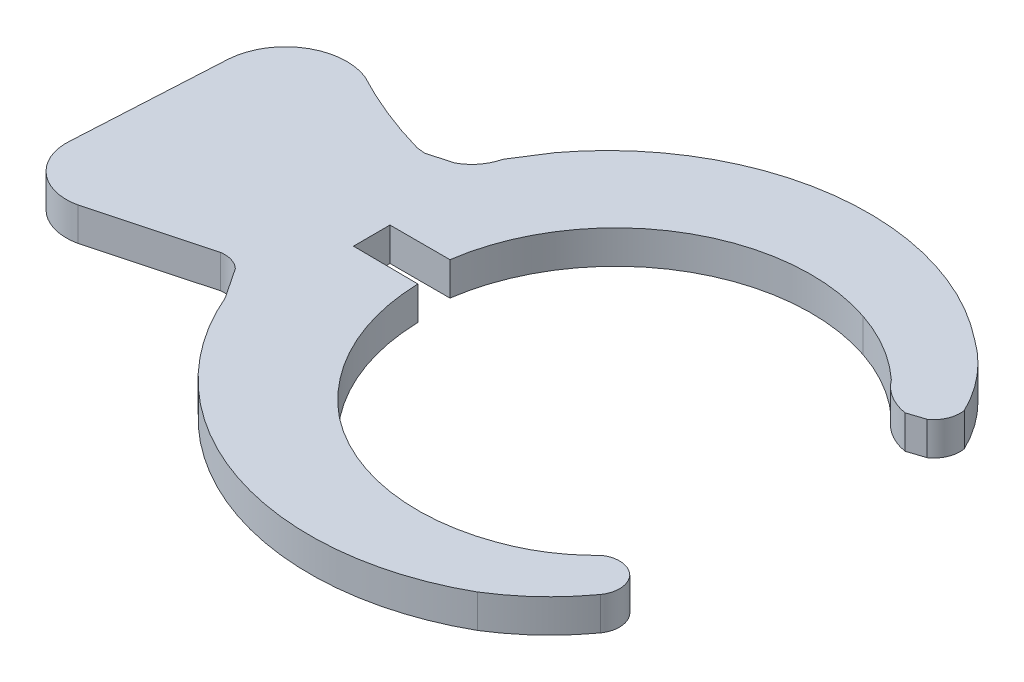
ISO-10303-21;
HEADER;
FILE_DESCRIPTION(('STEP AP214'),'2;1');
FILE_NAME('part.step','',(''),(''),'','','');
FILE_SCHEMA(('AUTOMOTIVE_DESIGN { 1 0 10303 214 1 1 1 1 }'));
ENDSEC;
DATA;
#1=APPLICATION_CONTEXT('core data for automotive mechanical design processes');
#2=APPLICATION_PROTOCOL_DEFINITION('international standard','automotive_design',2000,#1);
#3=PRODUCT_CONTEXT('',#1,'mechanical');
#4=PRODUCT('Part','Part','',(#3));
#5=PRODUCT_RELATED_PRODUCT_CATEGORY('part','',(#4));
#6=PRODUCT_DEFINITION_FORMATION('','',#4);
#7=PRODUCT_DEFINITION_CONTEXT('part definition',#1,'design');
#8=PRODUCT_DEFINITION('design','',#6,#7);
#9=PRODUCT_DEFINITION_SHAPE('','',#8);
#10=(LENGTH_UNIT() NAMED_UNIT(*) SI_UNIT(.MILLI.,.METRE.));
#11=(NAMED_UNIT(*) PLANE_ANGLE_UNIT() SI_UNIT($,.RADIAN.));
#12=(NAMED_UNIT(*) SI_UNIT($,.STERADIAN.) SOLID_ANGLE_UNIT());
#13=UNCERTAINTY_MEASURE_WITH_UNIT(LENGTH_MEASURE(1.E-05),#10,'distance_accuracy_value','');
#14=(GEOMETRIC_REPRESENTATION_CONTEXT(3) GLOBAL_UNCERTAINTY_ASSIGNED_CONTEXT((#13)) GLOBAL_UNIT_ASSIGNED_CONTEXT((#10,
#11,#12)) REPRESENTATION_CONTEXT('',''));
#15=CARTESIAN_POINT('',(0.,0.,0.));
#16=DIRECTION('',(0.,0.,1.));
#17=DIRECTION('',(1.,0.,0.));
#18=AXIS2_PLACEMENT_3D('',#15,#16,#17);
#19=CARTESIAN_POINT('',(-115.84125064242,3.,55.1050487044065));
#20=DIRECTION('',(0.,-1.,0.));
#21=DIRECTION('',(0.,0.,-1.));
#22=AXIS2_PLACEMENT_3D('',#19,#20,#21);
#23=CYLINDRICAL_SURFACE('',#22,18.5625576029);
#24=CARTESIAN_POINT('',(-115.84125064242,0.,55.1050487044065));
#25=DIRECTION('',(0.,-1.,0.));
#26=DIRECTION('',(0.,0.,1.));
#27=AXIS2_PLACEMENT_3D('',#24,#25,#26);
#28=CIRCLE('',#27,18.5625576029);
#29=CARTESIAN_POINT('',(-127.45028999998,0.,69.5894799999592));
#30=VERTEX_POINT('',#29);
#31=CARTESIAN_POINT('',(-134.397750000008,0.,55.5792599999155));
#32=VERTEX_POINT('',#31);
#33=EDGE_CURVE('E251',#30,#32,#28,.T.);
#34=ORIENTED_EDGE('',*,*,#33,.T.);
#35=DIRECTION('',(0.,-1.,0.));
#36=VECTOR('',#35,1.);
#37=CARTESIAN_POINT('',(-134.397750000008,3.,55.5792599999155));
#38=LINE('',#37,#36);
#39=CARTESIAN_POINT('',(-134.397750000008,3.,55.5792599999155));
#40=VERTEX_POINT('',#39);
#41=EDGE_CURVE('E11',#40,#32,#38,.T.);
#42=ORIENTED_EDGE('',*,*,#41,.F.);
#43=CARTESIAN_POINT('',(-115.84125064242,3.,55.1050487044065));
#44=DIRECTION('',(0.,-1.,0.));
#45=DIRECTION('',(0.,0.,1.));
#46=AXIS2_PLACEMENT_3D('',#43,#44,#45);
#47=CIRCLE('',#46,18.5625576029);
#48=CARTESIAN_POINT('',(-127.45028999998,3.,69.5894799999592));
#49=VERTEX_POINT('',#48);
#50=EDGE_CURVE('E305',#49,#40,#47,.T.);
#51=ORIENTED_EDGE('',*,*,#50,.F.);
#52=DIRECTION('',(0.,-1.,0.));
#53=VECTOR('',#52,1.);
#54=CARTESIAN_POINT('',(-127.45028999998,3.,69.5894799999592));
#55=LINE('',#54,#53);
#56=EDGE_CURVE('E247',#49,#30,#55,.T.);
#57=ORIENTED_EDGE('',*,*,#56,.T.);
#58=EDGE_LOOP('',(#34,#42,#51,#57));
#59=FACE_BOUND('',#58,.T.);
#60=ADVANCED_FACE('F35',(#59),#23,.F.);
#61=CARTESIAN_POINT('',(-134.397750000008,3.,55.5792599999155));
#62=DIRECTION('',(-0.0087259099224657,0.,0.999961928523294));
#63=DIRECTION('',(0.999961928523294,0.,0.0087259099224657));
#64=AXIS2_PLACEMENT_3D('',#61,#62,#63);
#65=PLANE('',#64);
#66=DIRECTION('',(-0.999961928523294,0.,-0.0087259099224657));
#67=VECTOR('',#66,1.);
#68=CARTESIAN_POINT('',(-134.397750000008,0.,55.5792599999155));
#69=LINE('',#68,#67);
#70=CARTESIAN_POINT('',(-140.247920000008,0.,55.5282099999155));
#71=VERTEX_POINT('',#70);
#72=EDGE_CURVE('E254',#32,#71,#69,.T.);
#73=ORIENTED_EDGE('',*,*,#72,.T.);
#74=DIRECTION('',(0.,-1.,0.));
#75=VECTOR('',#74,1.);
#76=CARTESIAN_POINT('',(-140.247920000008,3.,55.5282099999155));
#77=LINE('',#76,#75);
#78=CARTESIAN_POINT('',(-140.247920000008,3.,55.5282099999155));
#79=VERTEX_POINT('',#78);
#80=EDGE_CURVE('E43',#79,#71,#77,.T.);
#81=ORIENTED_EDGE('',*,*,#80,.F.);
#82=DIRECTION('',(-0.999961928523294,0.,-0.0087259099224657));
#83=VECTOR('',#82,1.);
#84=CARTESIAN_POINT('',(-134.397750000008,3.,55.5792599999155));
#85=LINE('',#84,#83);
#86=EDGE_CURVE('E154',#40,#79,#85,.T.);
#87=ORIENTED_EDGE('',*,*,#86,.F.);
#88=ORIENTED_EDGE('',*,*,#41,.T.);
#89=EDGE_LOOP('',(#73,#81,#87,#88));
#90=FACE_BOUND('',#89,.T.);
#91=ADVANCED_FACE('F463',(#90),#65,.F.);
#92=CARTESIAN_POINT('',(-140.247920000008,3.,55.5282099999155));
#93=DIRECTION('',(-0.999997104749262,0.,0.00240634434207758));
#94=DIRECTION('',(0.00240634434207758,0.,0.999997104749263));
#95=AXIS2_PLACEMENT_3D('',#92,#93,#94);
#96=PLANE('',#95);
#97=DIRECTION('',(-0.00240634434207758,0.,-0.999997104749262));
#98=VECTOR('',#97,1.);
#99=CARTESIAN_POINT('',(-140.247920000008,0.,55.5282099999155));
#100=LINE('',#99,#98);
#101=CARTESIAN_POINT('',(-140.255840000008,0.,52.2369199999155));
#102=VERTEX_POINT('',#101);
#103=EDGE_CURVE('E256',#71,#102,#100,.T.);
#104=ORIENTED_EDGE('',*,*,#103,.T.);
#105=DIRECTION('',(0.,-1.,0.));
#106=VECTOR('',#105,1.);
#107=CARTESIAN_POINT('',(-140.255840000008,3.,52.2369199999155));
#108=LINE('',#107,#106);
#109=CARTESIAN_POINT('',(-140.255840000008,3.,52.2369199999155));
#110=VERTEX_POINT('',#109);
#111=EDGE_CURVE('E372',#110,#102,#108,.T.);
#112=ORIENTED_EDGE('',*,*,#111,.F.);
#113=DIRECTION('',(-0.00240634434207758,0.,-0.999997104749262));
#114=VECTOR('',#113,1.);
#115=CARTESIAN_POINT('',(-140.247920000008,3.,55.5282099999155));
#116=LINE('',#115,#114);
#117=EDGE_CURVE('E380',#79,#110,#116,.T.);
#118=ORIENTED_EDGE('',*,*,#117,.F.);
#119=ORIENTED_EDGE('',*,*,#80,.T.);
#120=EDGE_LOOP('',(#104,#112,#118,#119));
#121=FACE_BOUND('',#120,.T.);
#122=ADVANCED_FACE('F378',(#121),#96,.F.);
#123=CARTESIAN_POINT('',(-140.255840000008,3.,52.2369199999155));
#124=DIRECTION('',(0.000146182323054566,0.,-0.999999989315364));
#125=DIRECTION('',(-0.999999989315364,0.,-0.000146182323054566));
#126=AXIS2_PLACEMENT_3D('',#123,#124,#125);
#127=PLANE('',#126);
#128=DIRECTION('',(0.999999989315364,0.,0.000146182323054566));
#129=VECTOR('',#128,1.);
#130=CARTESIAN_POINT('',(-140.255840000008,0.,52.2369199999155));
#131=LINE('',#130,#129);
#132=CARTESIAN_POINT('',(-134.851630000005,0.,52.237709999896));
#133=VERTEX_POINT('',#132);
#134=EDGE_CURVE('E258',#102,#133,#131,.T.);
#135=ORIENTED_EDGE('',*,*,#134,.T.);
#136=DIRECTION('',(0.,-1.,0.));
#137=VECTOR('',#136,1.);
#138=CARTESIAN_POINT('',(-134.851630000005,3.,52.237709999896));
#139=LINE('',#138,#137);
#140=CARTESIAN_POINT('',(-134.851630000005,3.,52.237709999896));
#141=VERTEX_POINT('',#140);
#142=EDGE_CURVE('E369',#141,#133,#139,.T.);
#143=ORIENTED_EDGE('',*,*,#142,.F.);
#144=DIRECTION('',(0.999999989315364,0.,0.000146182323054566));
#145=VECTOR('',#144,1.);
#146=CARTESIAN_POINT('',(-140.255840000008,3.,52.2369199999155));
#147=LINE('',#146,#145);
#148=EDGE_CURVE('E398',#110,#141,#147,.T.);
#149=ORIENTED_EDGE('',*,*,#148,.F.);
#150=ORIENTED_EDGE('',*,*,#111,.T.);
#151=EDGE_LOOP('',(#135,#143,#149,#150));
#152=FACE_BOUND('',#151,.T.);
#153=ADVANCED_FACE('F389',(#152),#127,.F.);
#154=CARTESIAN_POINT('',(-117.421689365609,3.,54.7403896087203));
#155=DIRECTION('',(0.,-1.,0.));
#156=DIRECTION('',(0.,0.,-1.));
#157=AXIS2_PLACEMENT_3D('',#154,#155,#156);
#158=CYLINDRICAL_SURFACE('',#157,17.6086977299);
#159=CARTESIAN_POINT('',(-117.421689365609,0.,54.7403896087203));
#160=DIRECTION('',(0.,-1.,0.));
#161=DIRECTION('',(0.,0.,1.));
#162=AXIS2_PLACEMENT_3D('',#159,#160,#161);
#163=CIRCLE('',#162,17.6086977299);
#164=CARTESIAN_POINT('',(-111.830230000023,0.,38.0430299999083));
#165=VERTEX_POINT('',#164);
#166=EDGE_CURVE('E260',#133,#165,#163,.T.);
#167=ORIENTED_EDGE('',*,*,#166,.T.);
#168=DIRECTION('',(0.,-1.,0.));
#169=VECTOR('',#168,1.);
#170=CARTESIAN_POINT('',(-111.830230000023,3.,38.0430299999083));
#171=LINE('',#170,#169);
#172=CARTESIAN_POINT('',(-111.830230000023,3.,38.0430299999083));
#173=VERTEX_POINT('',#172);
#174=EDGE_CURVE('E366',#173,#165,#171,.T.);
#175=ORIENTED_EDGE('',*,*,#174,.F.);
#176=CARTESIAN_POINT('',(-117.421689365609,3.,54.7403896087203));
#177=DIRECTION('',(0.,-1.,0.));
#178=DIRECTION('',(0.,0.,1.));
#179=AXIS2_PLACEMENT_3D('',#176,#177,#178);
#180=CIRCLE('',#179,17.6086977299);
#181=EDGE_CURVE('E395',#141,#173,#180,.T.);
#182=ORIENTED_EDGE('',*,*,#181,.F.);
#183=ORIENTED_EDGE('',*,*,#142,.T.);
#184=EDGE_LOOP('',(#167,#175,#182,#183));
#185=FACE_BOUND('',#184,.T.);
#186=ADVANCED_FACE('F393',(#185),#158,.F.);
#187=CARTESIAN_POINT('',(-117.315879580908,3.,54.4220661576155));
#188=DIRECTION('',(0.,-1.,0.));
#189=DIRECTION('',(0.,0.,-1.));
#190=AXIS2_PLACEMENT_3D('',#187,#188,#189);
#191=CYLINDRICAL_SURFACE('',#190,17.2732503247);
#192=CARTESIAN_POINT('',(-117.315879580908,0.,54.4220661576155));
#193=DIRECTION('',(0.,-1.,0.));
#194=DIRECTION('',(0.,0.,1.));
#195=AXIS2_PLACEMENT_3D('',#192,#193,#194);
#196=CIRCLE('',#195,17.2732503247);
#197=CARTESIAN_POINT('',(-105.613130000012,0.,41.7173099999166));
#198=VERTEX_POINT('',#197);
#199=EDGE_CURVE('E262',#165,#198,#196,.T.);
#200=ORIENTED_EDGE('',*,*,#199,.T.);
#201=DIRECTION('',(0.,-1.,0.));
#202=VECTOR('',#201,1.);
#203=CARTESIAN_POINT('',(-105.613130000012,3.,41.7173099999166));
#204=LINE('',#203,#202);
#205=CARTESIAN_POINT('',(-105.613130000012,3.,41.7173099999166));
#206=VERTEX_POINT('',#205);
#207=EDGE_CURVE('E363',#206,#198,#204,.T.);
#208=ORIENTED_EDGE('',*,*,#207,.F.);
#209=CARTESIAN_POINT('',(-117.315879580908,3.,54.4220661576155));
#210=DIRECTION('',(0.,-1.,0.));
#211=DIRECTION('',(0.,0.,1.));
#212=AXIS2_PLACEMENT_3D('',#209,#210,#211);
#213=CIRCLE('',#212,17.2732503247);
#214=EDGE_CURVE('E397',#173,#206,#213,.T.);
#215=ORIENTED_EDGE('',*,*,#214,.F.);
#216=ORIENTED_EDGE('',*,*,#174,.T.);
#217=EDGE_LOOP('',(#200,#208,#215,#216));
#218=FACE_BOUND('',#217,.T.);
#219=ADVANCED_FACE('F476',(#218),#191,.F.);
#220=CARTESIAN_POINT('',(-101.569502431215,3.,38.7369746632966));
#221=DIRECTION('',(0.,-1.,0.));
#222=DIRECTION('',(0.,0.,-1.));
#223=AXIS2_PLACEMENT_3D('',#220,#221,#222);
#224=CYLINDRICAL_SURFACE('',#223,5.0232780765);
#225=CARTESIAN_POINT('',(-101.569502431215,0.,38.7369746632966));
#226=DIRECTION('',(0.,1.,0.));
#227=DIRECTION('',(0.,0.,1.));
#228=AXIS2_PLACEMENT_3D('',#225,#226,#227);
#229=CIRCLE('',#228,5.0232780765);
#230=CARTESIAN_POINT('',(-102.413160000031,0.,43.6889000000141));
#231=VERTEX_POINT('',#230);
#232=EDGE_CURVE('E264',#198,#231,#229,.T.);
#233=ORIENTED_EDGE('',*,*,#232,.T.);
#234=DIRECTION('',(0.,-1.,0.));
#235=VECTOR('',#234,1.);
#236=CARTESIAN_POINT('',(-102.413160000031,3.,43.6889000000141));
#237=LINE('',#236,#235);
#238=CARTESIAN_POINT('',(-102.413160000031,3.,43.6889000000141));
#239=VERTEX_POINT('',#238);
#240=EDGE_CURVE('E360',#239,#231,#237,.T.);
#241=ORIENTED_EDGE('',*,*,#240,.F.);
#242=CARTESIAN_POINT('',(-101.569502431215,3.,38.7369746632966));
#243=DIRECTION('',(0.,1.,0.));
#244=DIRECTION('',(0.,0.,1.));
#245=AXIS2_PLACEMENT_3D('',#242,#243,#244);
#246=CIRCLE('',#245,5.0232780765);
#247=EDGE_CURVE('E400',#206,#239,#246,.T.);
#248=ORIENTED_EDGE('',*,*,#247,.F.);
#249=ORIENTED_EDGE('',*,*,#207,.T.);
#250=EDGE_LOOP('',(#233,#241,#248,#249));
#251=FACE_BOUND('',#250,.T.);
#252=ADVANCED_FACE('F479',(#251),#224,.T.);
#253=CARTESIAN_POINT('',(-102.413160000031,3.,43.6889000000141));
#254=DIRECTION('',(-0.312955682567684,0.,-0.949767729894312));
#255=DIRECTION('',(-0.949767729894312,0.,0.312955682567684));
#256=AXIS2_PLACEMENT_3D('',#253,#254,#255);
#257=PLANE('',#256);
#258=DIRECTION('',(0.949767729894312,0.,-0.312955682567684));
#259=VECTOR('',#258,1.);
#260=CARTESIAN_POINT('',(-102.413160000031,0.,43.6889000000141));
#261=LINE('',#260,#259);
#262=CARTESIAN_POINT('',(-100.90931000003,0.,43.193369999977));
#263=VERTEX_POINT('',#262);
#264=EDGE_CURVE('E266',#231,#263,#261,.T.);
#265=ORIENTED_EDGE('',*,*,#264,.T.);
#266=DIRECTION('',(0.,-1.,0.));
#267=VECTOR('',#266,1.);
#268=CARTESIAN_POINT('',(-100.90931000003,3.,43.193369999977));
#269=LINE('',#268,#267);
#270=CARTESIAN_POINT('',(-100.90931000003,3.,43.193369999977));
#271=VERTEX_POINT('',#270);
#272=EDGE_CURVE('E357',#271,#263,#269,.T.);
#273=ORIENTED_EDGE('',*,*,#272,.F.);
#274=DIRECTION('',(0.949767729894312,0.,-0.312955682567684));
#275=VECTOR('',#274,1.);
#276=CARTESIAN_POINT('',(-102.413160000031,3.,43.6889000000141));
#277=LINE('',#276,#275);
#278=EDGE_CURVE('E406',#239,#271,#277,.T.);
#279=ORIENTED_EDGE('',*,*,#278,.F.);
#280=ORIENTED_EDGE('',*,*,#240,.T.);
#281=EDGE_LOOP('',(#265,#273,#279,#280));
#282=FACE_BOUND('',#281,.T.);
#283=ADVANCED_FACE('F483',(#282),#257,.F.);
#284=CARTESIAN_POINT('',(-102.248851237042,3.,41.2551130227134));
#285=DIRECTION('',(0.,-1.,0.));
#286=DIRECTION('',(0.,0.,-1.));
#287=AXIS2_PLACEMENT_3D('',#284,#285,#286);
#288=CYLINDRICAL_SURFACE('',#287,2.35610076939999);
#289=CARTESIAN_POINT('',(-102.248851237042,0.,41.2551130227134));
#290=DIRECTION('',(0.,1.,0.));
#291=DIRECTION('',(0.,0.,1.));
#292=AXIS2_PLACEMENT_3D('',#289,#290,#291);
#293=CIRCLE('',#292,2.35610076939999);
#294=CARTESIAN_POINT('',(-99.934789999997,0.,40.8120200000054));
#295=VERTEX_POINT('',#294);
#296=EDGE_CURVE('E268',#263,#295,#293,.T.);
#297=ORIENTED_EDGE('',*,*,#296,.T.);
#298=DIRECTION('',(0.,-1.,0.));
#299=VECTOR('',#298,1.);
#300=CARTESIAN_POINT('',(-99.934789999997,3.,40.8120200000054));
#301=LINE('',#300,#299);
#302=CARTESIAN_POINT('',(-99.934789999997,3.,40.8120200000054));
#303=VERTEX_POINT('',#302);
#304=EDGE_CURVE('E354',#303,#295,#301,.T.);
#305=ORIENTED_EDGE('',*,*,#304,.F.);
#306=CARTESIAN_POINT('',(-102.248851237042,3.,41.2551130227134));
#307=DIRECTION('',(0.,1.,0.));
#308=DIRECTION('',(0.,0.,1.));
#309=AXIS2_PLACEMENT_3D('',#306,#307,#308);
#310=CIRCLE('',#309,2.35610076939999);
#311=EDGE_CURVE('E408',#271,#303,#310,.T.);
#312=ORIENTED_EDGE('',*,*,#311,.F.);
#313=ORIENTED_EDGE('',*,*,#272,.T.);
#314=EDGE_LOOP('',(#297,#305,#312,#313));
#315=FACE_BOUND('',#314,.T.);
#316=ADVANCED_FACE('F487',(#315),#288,.T.);
#317=CARTESIAN_POINT('',(-114.29319021155,3.,47.8417897502344));
#318=DIRECTION('',(0.,-1.,0.));
#319=DIRECTION('',(0.,0.,-1.));
#320=AXIS2_PLACEMENT_3D('',#317,#318,#319);
#321=CYLINDRICAL_SURFACE('',#320,15.9869108766);
#322=CARTESIAN_POINT('',(-114.29319021155,0.,47.8417897502344));
#323=DIRECTION('',(0.,1.,0.));
#324=DIRECTION('',(0.,0.,1.));
#325=AXIS2_PLACEMENT_3D('',#322,#323,#324);
#326=CIRCLE('',#325,15.9869108766);
#327=CARTESIAN_POINT('',(-104.994320000054,0.,34.8374700000088));
#328=VERTEX_POINT('',#327);
#329=EDGE_CURVE('E270',#295,#328,#326,.T.);
#330=ORIENTED_EDGE('',*,*,#329,.T.);
#331=DIRECTION('',(0.,-1.,0.));
#332=VECTOR('',#331,1.);
#333=CARTESIAN_POINT('',(-104.994320000054,3.,34.8374700000088));
#334=LINE('',#333,#332);
#335=CARTESIAN_POINT('',(-104.994320000054,3.,34.8374700000088));
#336=VERTEX_POINT('',#335);
#337=EDGE_CURVE('E351',#336,#328,#334,.T.);
#338=ORIENTED_EDGE('',*,*,#337,.F.);
#339=CARTESIAN_POINT('',(-114.29319021155,3.,47.8417897502344));
#340=DIRECTION('',(0.,1.,0.));
#341=DIRECTION('',(0.,0.,1.));
#342=AXIS2_PLACEMENT_3D('',#339,#340,#341);
#343=CIRCLE('',#342,15.9869108766);
#344=EDGE_CURVE('E410',#303,#336,#343,.T.);
#345=ORIENTED_EDGE('',*,*,#344,.F.);
#346=ORIENTED_EDGE('',*,*,#304,.T.);
#347=EDGE_LOOP('',(#330,#338,#345,#346));
#348=FACE_BOUND('',#347,.T.);
#349=ADVANCED_FACE('F491',(#348),#321,.T.);
#350=CARTESIAN_POINT('',(-119.629064928472,3.,53.2896393473336));
#351=DIRECTION('',(0.,-1.,0.));
#352=DIRECTION('',(0.,0.,-1.));
#353=AXIS2_PLACEMENT_3D('',#350,#351,#352);
#354=CYLINDRICAL_SURFACE('',#353,23.5511849541);
#355=CARTESIAN_POINT('',(-119.629064928472,0.,53.2896393473336));
#356=DIRECTION('',(0.,1.,0.));
#357=DIRECTION('',(0.,0.,1.));
#358=AXIS2_PLACEMENT_3D('',#355,#356,#357);
#359=CIRCLE('',#358,23.5511849541);
#360=CARTESIAN_POINT('',(-138.458890000006,0.,39.1441099999509));
#361=VERTEX_POINT('',#360);
#362=EDGE_CURVE('E272',#328,#361,#359,.T.);
#363=ORIENTED_EDGE('',*,*,#362,.T.);
#364=DIRECTION('',(0.,-1.,0.));
#365=VECTOR('',#364,1.);
#366=CARTESIAN_POINT('',(-138.458890000006,3.,39.1441099999509));
#367=LINE('',#366,#365);
#368=CARTESIAN_POINT('',(-138.458890000006,3.,39.1441099999509));
#369=VERTEX_POINT('',#368);
#370=EDGE_CURVE('E348',#369,#361,#367,.T.);
#371=ORIENTED_EDGE('',*,*,#370,.F.);
#372=CARTESIAN_POINT('',(-119.629064928472,3.,53.2896393473336));
#373=DIRECTION('',(0.,1.,0.));
#374=DIRECTION('',(0.,0.,1.));
#375=AXIS2_PLACEMENT_3D('',#372,#373,#374);
#376=CIRCLE('',#375,23.5511849541);
#377=EDGE_CURVE('E412',#336,#369,#376,.T.);
#378=ORIENTED_EDGE('',*,*,#377,.F.);
#379=ORIENTED_EDGE('',*,*,#337,.T.);
#380=EDGE_LOOP('',(#363,#371,#378,#379));
#381=FACE_BOUND('',#380,.T.);
#382=ADVANCED_FACE('F495',(#381),#354,.T.);
#383=CARTESIAN_POINT('',(-138.458890000006,3.,39.1441099999509));
#384=DIRECTION('',(0.843169686183783,0.,0.537647542820333));
#385=DIRECTION('',(0.537647542820333,0.,-0.843169686183783));
#386=AXIS2_PLACEMENT_3D('',#383,#384,#385);
#387=PLANE('',#386);
#388=DIRECTION('',(-0.537647542820333,0.,0.843169686183783));
#389=VECTOR('',#388,1.);
#390=CARTESIAN_POINT('',(-138.458890000006,0.,39.1441099999509));
#391=LINE('',#390,#389);
#392=CARTESIAN_POINT('',(-140.29547000003,0.,42.024339999977));
#393=VERTEX_POINT('',#392);
#394=EDGE_CURVE('E274',#361,#393,#391,.T.);
#395=ORIENTED_EDGE('',*,*,#394,.T.);
#396=DIRECTION('',(0.,-1.,0.));
#397=VECTOR('',#396,1.);
#398=CARTESIAN_POINT('',(-140.29547000003,3.,42.024339999977));
#399=LINE('',#398,#397);
#400=CARTESIAN_POINT('',(-140.29547000003,3.,42.024339999977));
#401=VERTEX_POINT('',#400);
#402=EDGE_CURVE('E345',#401,#393,#399,.T.);
#403=ORIENTED_EDGE('',*,*,#402,.F.);
#404=DIRECTION('',(-0.537647542820333,0.,0.843169686183783));
#405=VECTOR('',#404,1.);
#406=CARTESIAN_POINT('',(-138.458890000006,3.,39.1441099999509));
#407=LINE('',#406,#405);
#408=EDGE_CURVE('E414',#369,#401,#407,.T.);
#409=ORIENTED_EDGE('',*,*,#408,.F.);
#410=ORIENTED_EDGE('',*,*,#370,.T.);
#411=EDGE_LOOP('',(#395,#403,#409,#410));
#412=FACE_BOUND('',#411,.T.);
#413=ADVANCED_FACE('F499',(#412),#387,.F.);
#414=CARTESIAN_POINT('',(-143.97038051041,3.,41.1546606632818));
#415=DIRECTION('',(0.,-1.,0.));
#416=DIRECTION('',(0.,0.,-1.));
#417=AXIS2_PLACEMENT_3D('',#414,#415,#416);
#418=CYLINDRICAL_SURFACE('',#417,3.77641488822067);
#419=CARTESIAN_POINT('',(-143.97038051041,0.,41.1546606632818));
#420=DIRECTION('',(0.,-1.,0.));
#421=DIRECTION('',(0.,0.,1.));
#422=AXIS2_PLACEMENT_3D('',#419,#420,#421);
#423=CIRCLE('',#422,3.77641488822067);
#424=CARTESIAN_POINT('',(-142.188020000042,0.,44.4840000000056));
#425=VERTEX_POINT('',#424);
#426=EDGE_CURVE('E276',#393,#425,#423,.T.);
#427=ORIENTED_EDGE('',*,*,#426,.T.);
#428=DIRECTION('',(0.,-1.,0.));
#429=VECTOR('',#428,1.);
#430=CARTESIAN_POINT('',(-142.188020000042,3.,44.4840000000056));
#431=LINE('',#430,#429);
#432=CARTESIAN_POINT('',(-142.188020000042,3.,44.4840000000056));
#433=VERTEX_POINT('',#432);
#434=EDGE_CURVE('E342',#433,#425,#431,.T.);
#435=ORIENTED_EDGE('',*,*,#434,.F.);
#436=CARTESIAN_POINT('',(-143.97038051041,3.,41.1546606632818));
#437=DIRECTION('',(0.,-1.,0.));
#438=DIRECTION('',(0.,0.,1.));
#439=AXIS2_PLACEMENT_3D('',#436,#437,#438);
#440=CIRCLE('',#439,3.77641488822067);
#441=EDGE_CURVE('E416',#401,#433,#440,.T.);
#442=ORIENTED_EDGE('',*,*,#441,.F.);
#443=ORIENTED_EDGE('',*,*,#402,.T.);
#444=EDGE_LOOP('',(#427,#435,#442,#443));
#445=FACE_BOUND('',#444,.T.);
#446=ADVANCED_FACE('F503',(#445),#418,.F.);
#447=CARTESIAN_POINT('',(-142.188020000042,3.,44.4840000000056));
#448=DIRECTION('',(0.265590744986099,0.,0.964085865562673));
#449=DIRECTION('',(0.964085865562673,0.,-0.265590744986099));
#450=AXIS2_PLACEMENT_3D('',#447,#448,#449);
#451=PLANE('',#450);
#452=DIRECTION('',(-0.964085865562673,0.,0.265590744986099));
#453=VECTOR('',#452,1.);
#454=CARTESIAN_POINT('',(-142.188020000042,0.,44.4840000000056));
#455=LINE('',#454,#453);
#456=CARTESIAN_POINT('',(-144.31068,0.,45.06876));
#457=VERTEX_POINT('',#456);
#458=EDGE_CURVE('E278',#425,#457,#455,.T.);
#459=ORIENTED_EDGE('',*,*,#458,.T.);
#460=DIRECTION('',(0.,-1.,0.));
#461=VECTOR('',#460,1.);
#462=CARTESIAN_POINT('',(-144.31068,3.,45.06876));
#463=LINE('',#462,#461);
#464=CARTESIAN_POINT('',(-144.31068,3.,45.06876));
#465=VERTEX_POINT('',#464);
#466=EDGE_CURVE('E339',#465,#457,#463,.T.);
#467=ORIENTED_EDGE('',*,*,#466,.F.);
#468=DIRECTION('',(-0.964085865562673,0.,0.265590744986099));
#469=VECTOR('',#468,1.);
#470=CARTESIAN_POINT('',(-142.188020000042,3.,44.4840000000056));
#471=LINE('',#470,#469);
#472=EDGE_CURVE('E418',#433,#465,#471,.T.);
#473=ORIENTED_EDGE('',*,*,#472,.F.);
#474=ORIENTED_EDGE('',*,*,#434,.T.);
#475=EDGE_LOOP('',(#459,#467,#473,#474));
#476=FACE_BOUND('',#475,.T.);
#477=ADVANCED_FACE('F507',(#476),#451,.F.);
#478=CARTESIAN_POINT('',(-144.31068,3.,45.06876));
#479=DIRECTION('',(-0.106263692411247,0.,0.994337984628531));
#480=DIRECTION('',(0.994337984628531,0.,0.106263692411247));
#481=AXIS2_PLACEMENT_3D('',#478,#479,#480);
#482=PLANE('',#481);
#483=DIRECTION('',(-0.994337984628531,0.,-0.106263692411247));
#484=VECTOR('',#483,1.);
#485=CARTESIAN_POINT('',(-144.31068,0.,45.06876));
#486=LINE('',#485,#484);
#487=CARTESIAN_POINT('',(-145.050839999982,0.,44.9896600000109));
#488=VERTEX_POINT('',#487);
#489=EDGE_CURVE('E280',#457,#488,#486,.T.);
#490=ORIENTED_EDGE('',*,*,#489,.T.);
#491=DIRECTION('',(0.,-1.,0.));
#492=VECTOR('',#491,1.);
#493=CARTESIAN_POINT('',(-145.050839999982,3.,44.9896600000109));
#494=LINE('',#493,#492);
#495=CARTESIAN_POINT('',(-145.050839999982,3.,44.9896600000109));
#496=VERTEX_POINT('',#495);
#497=EDGE_CURVE('E336',#496,#488,#494,.T.);
#498=ORIENTED_EDGE('',*,*,#497,.F.);
#499=DIRECTION('',(-0.994337984628531,0.,-0.106263692411247));
#500=VECTOR('',#499,1.);
#501=CARTESIAN_POINT('',(-144.31068,3.,45.06876));
#502=LINE('',#501,#500);
#503=EDGE_CURVE('E420',#465,#496,#502,.T.);
#504=ORIENTED_EDGE('',*,*,#503,.F.);
#505=ORIENTED_EDGE('',*,*,#466,.T.);
#506=EDGE_LOOP('',(#490,#498,#504,#505));
#507=FACE_BOUND('',#506,.T.);
#508=ADVANCED_FACE('F511',(#507),#482,.F.);
#509=CARTESIAN_POINT('',(-134.1081536961,3.,6.5114665875));
#510=DIRECTION('',(0.,-1.,0.));
#511=DIRECTION('',(0.,0.,-1.));
#512=AXIS2_PLACEMENT_3D('',#509,#510,#511);
#513=CYLINDRICAL_SURFACE('',#512,40.0039217057);
#514=CARTESIAN_POINT('',(-134.1081536961,0.,6.5114665875));
#515=DIRECTION('',(0.,-1.,0.));
#516=DIRECTION('',(0.,0.,1.));
#517=AXIS2_PLACEMENT_3D('',#514,#515,#516);
#518=CIRCLE('',#517,40.0039217057);
#519=CARTESIAN_POINT('',(-152.967079999984,0.,41.7911300000165));
#520=VERTEX_POINT('',#519);
#521=EDGE_CURVE('E282',#488,#520,#518,.T.);
#522=ORIENTED_EDGE('',*,*,#521,.T.);
#523=DIRECTION('',(0.,-1.,0.));
#524=VECTOR('',#523,1.);
#525=CARTESIAN_POINT('',(-152.967079999984,3.,41.7911300000165));
#526=LINE('',#525,#524);
#527=CARTESIAN_POINT('',(-152.967079999984,3.,41.7911300000165));
#528=VERTEX_POINT('',#527);
#529=EDGE_CURVE('E333',#528,#520,#526,.T.);
#530=ORIENTED_EDGE('',*,*,#529,.F.);
#531=CARTESIAN_POINT('',(-134.1081536961,3.,6.5114665875));
#532=DIRECTION('',(0.,-1.,0.));
#533=DIRECTION('',(0.,0.,1.));
#534=AXIS2_PLACEMENT_3D('',#531,#532,#533);
#535=CIRCLE('',#534,40.0039217057);
#536=EDGE_CURVE('E422',#496,#528,#535,.T.);
#537=ORIENTED_EDGE('',*,*,#536,.F.);
#538=ORIENTED_EDGE('',*,*,#497,.T.);
#539=EDGE_LOOP('',(#522,#530,#537,#538));
#540=FACE_BOUND('',#539,.T.);
#541=ADVANCED_FACE('F515',(#540),#513,.F.);
#542=CARTESIAN_POINT('',(-154.963697629597,3.,46.9419384943593));
#543=DIRECTION('',(0.,-1.,0.));
#544=DIRECTION('',(0.,0.,-1.));
#545=AXIS2_PLACEMENT_3D('',#542,#543,#544);
#546=CYLINDRICAL_SURFACE('',#545,5.5242474695);
#547=CARTESIAN_POINT('',(-154.963697629597,0.,46.9419384943593));
#548=DIRECTION('',(0.,1.,0.));
#549=DIRECTION('',(0.,0.,1.));
#550=AXIS2_PLACEMENT_3D('',#547,#548,#549);
#551=CIRCLE('',#550,5.5242474695);
#552=CARTESIAN_POINT('',(-160.474709999952,0.,46.559770000016));
#553=VERTEX_POINT('',#552);
#554=EDGE_CURVE('E284',#520,#553,#551,.T.);
#555=ORIENTED_EDGE('',*,*,#554,.T.);
#556=DIRECTION('',(0.,-1.,0.));
#557=VECTOR('',#556,1.);
#558=CARTESIAN_POINT('',(-160.474709999952,3.,46.559770000016));
#559=LINE('',#558,#557);
#560=CARTESIAN_POINT('',(-160.474709999952,3.,46.559770000016));
#561=VERTEX_POINT('',#560);
#562=EDGE_CURVE('E330',#561,#553,#559,.T.);
#563=ORIENTED_EDGE('',*,*,#562,.F.);
#564=CARTESIAN_POINT('',(-154.963697629597,3.,46.9419384943593));
#565=DIRECTION('',(0.,1.,0.));
#566=DIRECTION('',(0.,0.,1.));
#567=AXIS2_PLACEMENT_3D('',#564,#565,#566);
#568=CIRCLE('',#567,5.5242474695);
#569=EDGE_CURVE('E424',#528,#561,#568,.T.);
#570=ORIENTED_EDGE('',*,*,#569,.F.);
#571=ORIENTED_EDGE('',*,*,#529,.T.);
#572=EDGE_LOOP('',(#555,#563,#570,#571));
#573=FACE_BOUND('',#572,.T.);
#574=ADVANCED_FACE('F519',(#573),#546,.T.);
#575=CARTESIAN_POINT('',(-160.474709999952,3.,46.559770000016));
#576=DIRECTION('',(0.998492310394667,0.,0.0548917669848517));
#577=DIRECTION('',(0.0548917669848517,0.,-0.998492310394667));
#578=AXIS2_PLACEMENT_3D('',#575,#576,#577);
#579=PLANE('',#578);
#580=DIRECTION('',(-0.0548917669848517,0.,0.998492310394667));
#581=VECTOR('',#580,1.);
#582=CARTESIAN_POINT('',(-160.474709999952,0.,46.559770000016));
#583=LINE('',#582,#581);
#584=CARTESIAN_POINT('',(-161.21708,0.,60.06363));
#585=VERTEX_POINT('',#584);
#586=EDGE_CURVE('E286',#553,#585,#583,.T.);
#587=ORIENTED_EDGE('',*,*,#586,.T.);
#588=DIRECTION('',(0.,-1.,0.));
#589=VECTOR('',#588,1.);
#590=CARTESIAN_POINT('',(-161.21708,3.,60.06363));
#591=LINE('',#590,#589);
#592=CARTESIAN_POINT('',(-161.21708,3.,60.06363));
#593=VERTEX_POINT('',#592);
#594=EDGE_CURVE('E327',#593,#585,#591,.T.);
#595=ORIENTED_EDGE('',*,*,#594,.F.);
#596=DIRECTION('',(-0.0548917669848517,0.,0.998492310394667));
#597=VECTOR('',#596,1.);
#598=CARTESIAN_POINT('',(-160.474709999952,3.,46.559770000016));
#599=LINE('',#598,#597);
#600=EDGE_CURVE('E426',#561,#593,#599,.T.);
#601=ORIENTED_EDGE('',*,*,#600,.F.);
#602=ORIENTED_EDGE('',*,*,#562,.T.);
#603=EDGE_LOOP('',(#587,#595,#601,#602));
#604=FACE_BOUND('',#603,.T.);
#605=ADVANCED_FACE('F523',(#604),#579,.F.);
#606=CARTESIAN_POINT('',(-156.821413178911,3.,60.4173872258804));
#607=DIRECTION('',(0.,-1.,0.));
#608=DIRECTION('',(0.,0.,-1.));
#609=AXIS2_PLACEMENT_3D('',#606,#607,#608);
#610=CYLINDRICAL_SURFACE('',#609,4.40987879389998);
#611=CARTESIAN_POINT('',(-156.821413178911,0.,60.4173872258804));
#612=DIRECTION('',(0.,1.,0.));
#613=DIRECTION('',(0.,0.,1.));
#614=AXIS2_PLACEMENT_3D('',#611,#612,#613);
#615=CIRCLE('',#614,4.40987879389998);
#616=CARTESIAN_POINT('',(-155.875760000039,0.,64.7246800000228));
#617=VERTEX_POINT('',#616);
#618=EDGE_CURVE('E288',#585,#617,#615,.T.);
#619=ORIENTED_EDGE('',*,*,#618,.T.);
#620=DIRECTION('',(0.,-1.,0.));
#621=VECTOR('',#620,1.);
#622=CARTESIAN_POINT('',(-155.875760000039,3.,64.7246800000228));
#623=LINE('',#622,#621);
#624=CARTESIAN_POINT('',(-155.875760000039,3.,64.7246800000228));
#625=VERTEX_POINT('',#624);
#626=EDGE_CURVE('E324',#625,#617,#623,.T.);
#627=ORIENTED_EDGE('',*,*,#626,.F.);
#628=CARTESIAN_POINT('',(-156.821413178911,3.,60.4173872258804));
#629=DIRECTION('',(0.,1.,0.));
#630=DIRECTION('',(0.,0.,1.));
#631=AXIS2_PLACEMENT_3D('',#628,#629,#630);
#632=CIRCLE('',#631,4.40987879389998);
#633=EDGE_CURVE('E428',#593,#625,#632,.T.);
#634=ORIENTED_EDGE('',*,*,#633,.F.);
#635=ORIENTED_EDGE('',*,*,#594,.T.);
#636=EDGE_LOOP('',(#619,#627,#634,#635));
#637=FACE_BOUND('',#636,.T.);
#638=ADVANCED_FACE('F527',(#637),#610,.T.);
#639=CARTESIAN_POINT('',(-155.875760000039,3.,64.7246800000227));
#640=DIRECTION('',(-0.259803588736883,0.,-0.965661480685357));
#641=DIRECTION('',(-0.965661480685357,0.,0.259803588736883));
#642=AXIS2_PLACEMENT_3D('',#639,#640,#641);
#643=PLANE('',#642);
#644=DIRECTION('',(0.965661480685357,0.,-0.259803588736883));
#645=VECTOR('',#644,1.);
#646=CARTESIAN_POINT('',(-155.875760000039,0.,64.7246800000227));
#647=LINE('',#646,#645);
#648=CARTESIAN_POINT('',(-145.76671,0.,62.00492));
#649=VERTEX_POINT('',#648);
#650=EDGE_CURVE('E290',#617,#649,#647,.T.);
#651=ORIENTED_EDGE('',*,*,#650,.T.);
#652=DIRECTION('',(0.,-1.,0.));
#653=VECTOR('',#652,1.);
#654=CARTESIAN_POINT('',(-145.76671,3.,62.00492));
#655=LINE('',#654,#653);
#656=CARTESIAN_POINT('',(-145.76671,3.,62.00492));
#657=VERTEX_POINT('',#656);
#658=EDGE_CURVE('E321',#657,#649,#655,.T.);
#659=ORIENTED_EDGE('',*,*,#658,.F.);
#660=DIRECTION('',(0.965661480685357,0.,-0.259803588736883));
#661=VECTOR('',#660,1.);
#662=CARTESIAN_POINT('',(-155.875760000039,3.,64.7246800000227));
#663=LINE('',#662,#661);
#664=EDGE_CURVE('E430',#625,#657,#663,.T.);
#665=ORIENTED_EDGE('',*,*,#664,.F.);
#666=ORIENTED_EDGE('',*,*,#626,.T.);
#667=EDGE_LOOP('',(#651,#659,#665,#666));
#668=FACE_BOUND('',#667,.T.);
#669=ADVANCED_FACE('F531',(#668),#643,.F.);
#670=CARTESIAN_POINT('',(-145.410401064204,3.,64.3323296779722));
#671=DIRECTION('',(0.,-1.,0.));
#672=DIRECTION('',(0.,0.,-1.));
#673=AXIS2_PLACEMENT_3D('',#670,#671,#672);
#674=CYLINDRICAL_SURFACE('',#673,2.35452582632817);
#675=CARTESIAN_POINT('',(-145.410401064204,0.,64.3323296779722));
#676=DIRECTION('',(0.,-1.,0.));
#677=DIRECTION('',(0.,0.,1.));
#678=AXIS2_PLACEMENT_3D('',#675,#676,#677);
#679=CIRCLE('',#678,2.35452582632817);
#680=CARTESIAN_POINT('',(-143.823469999947,0.,62.5929500000005));
#681=VERTEX_POINT('',#680);
#682=EDGE_CURVE('E292',#649,#681,#679,.T.);
#683=ORIENTED_EDGE('',*,*,#682,.T.);
#684=DIRECTION('',(0.,-1.,0.));
#685=VECTOR('',#684,1.);
#686=CARTESIAN_POINT('',(-143.823469999947,3.,62.5929500000005));
#687=LINE('',#686,#685);
#688=CARTESIAN_POINT('',(-143.823469999947,3.,62.5929500000005));
#689=VERTEX_POINT('',#688);
#690=EDGE_CURVE('E318',#689,#681,#687,.T.);
#691=ORIENTED_EDGE('',*,*,#690,.F.);
#692=CARTESIAN_POINT('',(-145.410401064204,3.,64.3323296779722));
#693=DIRECTION('',(0.,-1.,0.));
#694=DIRECTION('',(0.,0.,1.));
#695=AXIS2_PLACEMENT_3D('',#692,#693,#694);
#696=CIRCLE('',#695,2.35452582632817);
#697=EDGE_CURVE('E432',#657,#689,#696,.T.);
#698=ORIENTED_EDGE('',*,*,#697,.F.);
#699=ORIENTED_EDGE('',*,*,#658,.T.);
#700=EDGE_LOOP('',(#683,#691,#698,#699));
#701=FACE_BOUND('',#700,.T.);
#702=ADVANCED_FACE('F535',(#701),#674,.F.);
#703=CARTESIAN_POINT('',(-143.823469999947,3.,62.5929500000005));
#704=DIRECTION('',(0.832264154800335,0.,-0.554379271468987));
#705=DIRECTION('',(-0.554379271468987,0.,-0.832264154800335));
#706=AXIS2_PLACEMENT_3D('',#703,#704,#705);
#707=PLANE('',#706);
#708=DIRECTION('',(0.554379271468987,0.,0.832264154800335));
#709=VECTOR('',#708,1.);
#710=CARTESIAN_POINT('',(-143.823469999947,0.,62.5929500000005));
#711=LINE('',#710,#709);
#712=CARTESIAN_POINT('',(-141.985499999985,0.,65.3522099999514));
#713=VERTEX_POINT('',#712);
#714=EDGE_CURVE('E294',#681,#713,#711,.T.);
#715=ORIENTED_EDGE('',*,*,#714,.T.);
#716=DIRECTION('',(0.,-1.,0.));
#717=VECTOR('',#716,1.);
#718=CARTESIAN_POINT('',(-141.985499999985,3.,65.3522099999514));
#719=LINE('',#718,#717);
#720=CARTESIAN_POINT('',(-141.985499999985,3.,65.3522099999514));
#721=VERTEX_POINT('',#720);
#722=EDGE_CURVE('E315',#721,#713,#719,.T.);
#723=ORIENTED_EDGE('',*,*,#722,.F.);
#724=DIRECTION('',(0.554379271468987,0.,0.832264154800335));
#725=VECTOR('',#724,1.);
#726=CARTESIAN_POINT('',(-143.823469999947,3.,62.5929500000005));
#727=LINE('',#726,#725);
#728=EDGE_CURVE('E434',#689,#721,#727,.T.);
#729=ORIENTED_EDGE('',*,*,#728,.F.);
#730=ORIENTED_EDGE('',*,*,#690,.T.);
#731=EDGE_LOOP('',(#715,#723,#729,#730));
#732=FACE_BOUND('',#731,.T.);
#733=ADVANCED_FACE('F539',(#732),#707,.F.);
#734=CARTESIAN_POINT('',(-119.64017609786,3.,55.7349913175372));
#735=DIRECTION('',(0.,-1.,0.));
#736=DIRECTION('',(0.,0.,-1.));
#737=AXIS2_PLACEMENT_3D('',#734,#735,#736);
#738=CYLINDRICAL_SURFACE('',#737,24.3270301409);
#739=CARTESIAN_POINT('',(-119.64017609786,0.,55.7349913175372));
#740=DIRECTION('',(0.,1.,0.));
#741=DIRECTION('',(0.,0.,1.));
#742=AXIS2_PLACEMENT_3D('',#739,#740,#741);
#743=CIRCLE('',#742,24.3270301409);
#744=CARTESIAN_POINT('',(-107.699000000027,0.,76.9296299999206));
#745=VERTEX_POINT('',#744);
#746=EDGE_CURVE('E296',#713,#745,#743,.T.);
#747=ORIENTED_EDGE('',*,*,#746,.T.);
#748=DIRECTION('',(0.,-1.,0.));
#749=VECTOR('',#748,1.);
#750=CARTESIAN_POINT('',(-107.699000000027,3.,76.9296299999206));
#751=LINE('',#750,#749);
#752=CARTESIAN_POINT('',(-107.699000000027,3.,76.9296299999206));
#753=VERTEX_POINT('',#752);
#754=EDGE_CURVE('E312',#753,#745,#751,.T.);
#755=ORIENTED_EDGE('',*,*,#754,.F.);
#756=CARTESIAN_POINT('',(-119.64017609786,3.,55.7349913175372));
#757=DIRECTION('',(0.,1.,0.));
#758=DIRECTION('',(0.,0.,1.));
#759=AXIS2_PLACEMENT_3D('',#756,#757,#758);
#760=CIRCLE('',#759,24.3270301409);
#761=EDGE_CURVE('E436',#721,#753,#760,.T.);
#762=ORIENTED_EDGE('',*,*,#761,.F.);
#763=ORIENTED_EDGE('',*,*,#722,.T.);
#764=EDGE_LOOP('',(#747,#755,#762,#763));
#765=FACE_BOUND('',#764,.T.);
#766=ADVANCED_FACE('F543',(#765),#738,.T.);
#767=CARTESIAN_POINT('',(-118.519380373532,3.,59.5588303480781));
#768=DIRECTION('',(0.,-1.,0.));
#769=DIRECTION('',(0.,0.,-1.));
#770=AXIS2_PLACEMENT_3D('',#767,#768,#769);
#771=CYLINDRICAL_SURFACE('',#770,20.4652220113);
#772=CARTESIAN_POINT('',(-118.519380373532,0.,59.5588303480781));
#773=DIRECTION('',(0.,1.,0.));
#774=DIRECTION('',(0.,0.,1.));
#775=AXIS2_PLACEMENT_3D('',#772,#773,#774);
#776=CIRCLE('',#775,20.4652220113);
#777=CARTESIAN_POINT('',(-101.951289999963,0.,71.5723099999129));
#778=VERTEX_POINT('',#777);
#779=EDGE_CURVE('E298',#745,#778,#776,.T.);
#780=ORIENTED_EDGE('',*,*,#779,.T.);
#781=DIRECTION('',(0.,-1.,0.));
#782=VECTOR('',#781,1.);
#783=CARTESIAN_POINT('',(-101.951289999963,3.,71.5723099999129));
#784=LINE('',#783,#782);
#785=CARTESIAN_POINT('',(-101.951289999963,3.,71.5723099999129));
#786=VERTEX_POINT('',#785);
#787=EDGE_CURVE('E309',#786,#778,#784,.T.);
#788=ORIENTED_EDGE('',*,*,#787,.F.);
#789=CARTESIAN_POINT('',(-118.519380373532,3.,59.5588303480781));
#790=DIRECTION('',(0.,1.,0.));
#791=DIRECTION('',(0.,0.,1.));
#792=AXIS2_PLACEMENT_3D('',#789,#790,#791);
#793=CIRCLE('',#792,20.4652220113);
#794=EDGE_CURVE('E438',#753,#786,#793,.T.);
#795=ORIENTED_EDGE('',*,*,#794,.F.);
#796=ORIENTED_EDGE('',*,*,#754,.T.);
#797=EDGE_LOOP('',(#780,#788,#795,#796));
#798=FACE_BOUND('',#797,.T.);
#799=ADVANCED_FACE('F444',(#798),#771,.T.);
#800=CARTESIAN_POINT('',(-103.801730731606,3.,70.2793985150284));
#801=DIRECTION('',(0.,-1.,0.));
#802=DIRECTION('',(0.,0.,-1.));
#803=AXIS2_PLACEMENT_3D('',#800,#801,#802);
#804=CYLINDRICAL_SURFACE('',#803,2.2573770197);
#805=CARTESIAN_POINT('',(-103.801730731606,0.,70.2793985150284));
#806=DIRECTION('',(0.,1.,0.));
#807=DIRECTION('',(0.,0.,1.));
#808=AXIS2_PLACEMENT_3D('',#805,#806,#807);
#809=CIRCLE('',#808,2.2573770197);
#810=CARTESIAN_POINT('',(-102.130309999951,0.,68.762129999945));
#811=VERTEX_POINT('',#810);
#812=EDGE_CURVE('E300',#778,#811,#809,.T.);
#813=ORIENTED_EDGE('',*,*,#812,.T.);
#814=DIRECTION('',(0.,-1.,0.));
#815=VECTOR('',#814,1.);
#816=CARTESIAN_POINT('',(-102.130309999951,3.,68.762129999945));
#817=LINE('',#816,#815);
#818=CARTESIAN_POINT('',(-102.130309999951,3.,68.762129999945));
#819=VERTEX_POINT('',#818);
#820=EDGE_CURVE('E242',#819,#811,#817,.T.);
#821=ORIENTED_EDGE('',*,*,#820,.F.);
#822=CARTESIAN_POINT('',(-103.801730731606,3.,70.2793985150284));
#823=DIRECTION('',(0.,1.,0.));
#824=DIRECTION('',(0.,0.,1.));
#825=AXIS2_PLACEMENT_3D('',#822,#823,#824);
#826=CIRCLE('',#825,2.2573770197);
#827=EDGE_CURVE('E233',#786,#819,#826,.T.);
#828=ORIENTED_EDGE('',*,*,#827,.F.);
#829=ORIENTED_EDGE('',*,*,#787,.T.);
#830=EDGE_LOOP('',(#813,#821,#828,#829));
#831=FACE_BOUND('',#830,.T.);
#832=ADVANCED_FACE('F448',(#831),#804,.T.);
#833=CARTESIAN_POINT('',(-103.7176890796,3.,70.3316911358612));
#834=DIRECTION('',(0.,-1.,0.));
#835=DIRECTION('',(0.,0.,-1.));
#836=AXIS2_PLACEMENT_3D('',#833,#834,#835);
#837=CYLINDRICAL_SURFACE('',#836,2.2323293892);
#838=CARTESIAN_POINT('',(-103.7176890796,0.,70.3316911358612));
#839=DIRECTION('',(0.,1.,0.));
#840=DIRECTION('',(0.,0.,1.));
#841=AXIS2_PLACEMENT_3D('',#838,#839,#840);
#842=CIRCLE('',#841,2.2323293892);
#843=CARTESIAN_POINT('',(-104.948050000002,0.,68.4690299998963));
#844=VERTEX_POINT('',#843);
#845=EDGE_CURVE('E241',#811,#844,#842,.T.);
#846=ORIENTED_EDGE('',*,*,#845,.T.);
#847=DIRECTION('',(0.,-1.,0.));
#848=VECTOR('',#847,1.);
#849=CARTESIAN_POINT('',(-104.948050000002,3.,68.4690299998963));
#850=LINE('',#849,#848);
#851=CARTESIAN_POINT('',(-104.948050000002,3.,68.4690299998963));
#852=VERTEX_POINT('',#851);
#853=EDGE_CURVE('E238',#852,#844,#850,.T.);
#854=ORIENTED_EDGE('',*,*,#853,.F.);
#855=CARTESIAN_POINT('',(-103.7176890796,3.,70.3316911358612));
#856=DIRECTION('',(0.,1.,0.));
#857=DIRECTION('',(0.,0.,1.));
#858=AXIS2_PLACEMENT_3D('',#855,#856,#857);
#859=CIRCLE('',#858,2.2323293892);
#860=EDGE_CURVE('E227',#819,#852,#859,.T.);
#861=ORIENTED_EDGE('',*,*,#860,.F.);
#862=ORIENTED_EDGE('',*,*,#820,.T.);
#863=EDGE_LOOP('',(#846,#854,#861,#862));
#864=FACE_BOUND('',#863,.T.);
#865=ADVANCED_FACE('F239',(#864),#837,.T.);
#866=CARTESIAN_POINT('',(-115.652385941778,3.,58.1579773912083));
#867=DIRECTION('',(0.,-1.,0.));
#868=DIRECTION('',(0.,0.,-1.));
#869=AXIS2_PLACEMENT_3D('',#866,#867,#868);
#870=CYLINDRICAL_SURFACE('',#869,14.8627256535781);
#871=CARTESIAN_POINT('',(-115.652385941778,0.,58.1579773912083));
#872=DIRECTION('',(0.,-1.,0.));
#873=DIRECTION('',(0.,0.,1.));
#874=AXIS2_PLACEMENT_3D('',#871,#872,#873);
#875=CIRCLE('',#874,14.8627256535781);
#876=CARTESIAN_POINT('',(-110.717080000058,0.,72.1773699998469));
#877=VERTEX_POINT('',#876);
#878=EDGE_CURVE('E140',#844,#877,#875,.T.);
#879=ORIENTED_EDGE('',*,*,#878,.T.);
#880=DIRECTION('',(0.,-1.,0.));
#881=VECTOR('',#880,1.);
#882=CARTESIAN_POINT('',(-110.717080000058,3.,72.1773699998469));
#883=LINE('',#882,#881);
#884=CARTESIAN_POINT('',(-110.717080000058,3.,72.1773699998469));
#885=VERTEX_POINT('',#884);
#886=EDGE_CURVE('E243',#885,#877,#883,.T.);
#887=ORIENTED_EDGE('',*,*,#886,.F.);
#888=CARTESIAN_POINT('',(-115.652385941778,3.,58.1579773912083));
#889=DIRECTION('',(0.,-1.,0.));
#890=DIRECTION('',(0.,0.,1.));
#891=AXIS2_PLACEMENT_3D('',#888,#889,#890);
#892=CIRCLE('',#891,14.8627256535781);
#893=EDGE_CURVE('E231',#852,#885,#892,.T.);
#894=ORIENTED_EDGE('',*,*,#893,.F.);
#895=ORIENTED_EDGE('',*,*,#853,.T.);
#896=EDGE_LOOP('',(#879,#887,#894,#895));
#897=FACE_BOUND('',#896,.T.);
#898=ADVANCED_FACE('F245',(#897),#870,.F.);
#899=CARTESIAN_POINT('',(-116.737428669277,3.,55.7126102057405));
#900=DIRECTION('',(0.,-1.,0.));
#901=DIRECTION('',(0.,0.,-1.));
#902=AXIS2_PLACEMENT_3D('',#899,#900,#901);
#903=CYLINDRICAL_SURFACE('',#902,17.5309130731);
#904=CARTESIAN_POINT('',(-116.737428669277,0.,55.7126102057405));
#905=DIRECTION('',(0.,-1.,0.));
#906=DIRECTION('',(0.,0.,1.));
#907=AXIS2_PLACEMENT_3D('',#904,#905,#906);
#908=CIRCLE('',#907,17.5309130731);
#909=EDGE_CURVE('E146',#877,#30,#908,.T.);
#910=ORIENTED_EDGE('',*,*,#909,.T.);
#911=ORIENTED_EDGE('',*,*,#56,.F.);
#912=CARTESIAN_POINT('',(-116.737428669277,3.,55.7126102057405));
#913=DIRECTION('',(0.,-1.,0.));
#914=DIRECTION('',(0.,0.,1.));
#915=AXIS2_PLACEMENT_3D('',#912,#913,#914);
#916=CIRCLE('',#915,17.5309130731);
#917=EDGE_CURVE('E51',#885,#49,#916,.T.);
#918=ORIENTED_EDGE('',*,*,#917,.F.);
#919=ORIENTED_EDGE('',*,*,#886,.T.);
#920=EDGE_LOOP('',(#910,#911,#918,#919));
#921=FACE_BOUND('',#920,.T.);
#922=ADVANCED_FACE('F452',(#921),#903,.F.);
#923=CARTESIAN_POINT('',(-115.84125064242,3.,55.1050487044065));
#924=DIRECTION('',(0.,1.,0.));
#925=DIRECTION('',(0.,0.,1.));
#926=AXIS2_PLACEMENT_3D('',#923,#924,#925);
#927=PLANE('',#926);
#928=ORIENTED_EDGE('',*,*,#50,.T.);
#929=ORIENTED_EDGE('',*,*,#86,.T.);
#930=ORIENTED_EDGE('',*,*,#117,.T.);
#931=ORIENTED_EDGE('',*,*,#148,.T.);
#932=ORIENTED_EDGE('',*,*,#181,.T.);
#933=ORIENTED_EDGE('',*,*,#214,.T.);
#934=ORIENTED_EDGE('',*,*,#247,.T.);
#935=ORIENTED_EDGE('',*,*,#278,.T.);
#936=ORIENTED_EDGE('',*,*,#311,.T.);
#937=ORIENTED_EDGE('',*,*,#344,.T.);
#938=ORIENTED_EDGE('',*,*,#377,.T.);
#939=ORIENTED_EDGE('',*,*,#408,.T.);
#940=ORIENTED_EDGE('',*,*,#441,.T.);
#941=ORIENTED_EDGE('',*,*,#472,.T.);
#942=ORIENTED_EDGE('',*,*,#503,.T.);
#943=ORIENTED_EDGE('',*,*,#536,.T.);
#944=ORIENTED_EDGE('',*,*,#569,.T.);
#945=ORIENTED_EDGE('',*,*,#600,.T.);
#946=ORIENTED_EDGE('',*,*,#633,.T.);
#947=ORIENTED_EDGE('',*,*,#664,.T.);
#948=ORIENTED_EDGE('',*,*,#697,.T.);
#949=ORIENTED_EDGE('',*,*,#728,.T.);
#950=ORIENTED_EDGE('',*,*,#761,.T.);
#951=ORIENTED_EDGE('',*,*,#794,.T.);
#952=ORIENTED_EDGE('',*,*,#827,.T.);
#953=ORIENTED_EDGE('',*,*,#860,.T.);
#954=ORIENTED_EDGE('',*,*,#893,.T.);
#955=ORIENTED_EDGE('',*,*,#917,.T.);
#956=EDGE_LOOP('',(#928,#929,#930,#931,#932,#933,#934,#935,#936,#937,#938,#939,#940,#941,#942,
#943,#944,#945,#946,#947,#948,#949,#950,#951,#952,#953,#954,#955));
#957=FACE_BOUND('',#956,.T.);
#958=ADVANCED_FACE('F229',(#957),#927,.T.);
#959=CARTESIAN_POINT('',(-115.84125064242,0.,55.1050487044065));
#960=DIRECTION('',(0.,1.,0.));
#961=DIRECTION('',(0.,0.,1.));
#962=AXIS2_PLACEMENT_3D('',#959,#960,#961);
#963=PLANE('',#962);
#964=ORIENTED_EDGE('',*,*,#33,.F.);
#965=ORIENTED_EDGE('',*,*,#909,.F.);
#966=ORIENTED_EDGE('',*,*,#878,.F.);
#967=ORIENTED_EDGE('',*,*,#845,.F.);
#968=ORIENTED_EDGE('',*,*,#812,.F.);
#969=ORIENTED_EDGE('',*,*,#779,.F.);
#970=ORIENTED_EDGE('',*,*,#746,.F.);
#971=ORIENTED_EDGE('',*,*,#714,.F.);
#972=ORIENTED_EDGE('',*,*,#682,.F.);
#973=ORIENTED_EDGE('',*,*,#650,.F.);
#974=ORIENTED_EDGE('',*,*,#618,.F.);
#975=ORIENTED_EDGE('',*,*,#586,.F.);
#976=ORIENTED_EDGE('',*,*,#554,.F.);
#977=ORIENTED_EDGE('',*,*,#521,.F.);
#978=ORIENTED_EDGE('',*,*,#489,.F.);
#979=ORIENTED_EDGE('',*,*,#458,.F.);
#980=ORIENTED_EDGE('',*,*,#426,.F.);
#981=ORIENTED_EDGE('',*,*,#394,.F.);
#982=ORIENTED_EDGE('',*,*,#362,.F.);
#983=ORIENTED_EDGE('',*,*,#329,.F.);
#984=ORIENTED_EDGE('',*,*,#296,.F.);
#985=ORIENTED_EDGE('',*,*,#264,.F.);
#986=ORIENTED_EDGE('',*,*,#232,.F.);
#987=ORIENTED_EDGE('',*,*,#199,.F.);
#988=ORIENTED_EDGE('',*,*,#166,.F.);
#989=ORIENTED_EDGE('',*,*,#134,.F.);
#990=ORIENTED_EDGE('',*,*,#103,.F.);
#991=ORIENTED_EDGE('',*,*,#72,.F.);
#992=EDGE_LOOP('',(#964,#965,#966,#967,#968,#969,#970,#971,#972,#973,#974,#975,#976,#977,#978,
#979,#980,#981,#982,#983,#984,#985,#986,#987,#988,#989,#990,#991));
#993=FACE_BOUND('',#992,.T.);
#994=ADVANCED_FACE('F384',(#993),#963,.F.);
#995=CLOSED_SHELL('',(#60,#91,#122,#153,#186,#219,#252,#283,#316,#349,#382,#413,#446,#477,#508,
#541,#574,#605,#638,#669,#702,#733,#766,#799,#832,#865,#898,#922,#958,#994));
#996=MANIFOLD_SOLID_BREP('B2',#995);
#997=ADVANCED_BREP_SHAPE_REPRESENTATION('',(#18,#996),#14);
#998=SHAPE_DEFINITION_REPRESENTATION(#9,#997);
ENDSEC;
END-ISO-10303-21;
